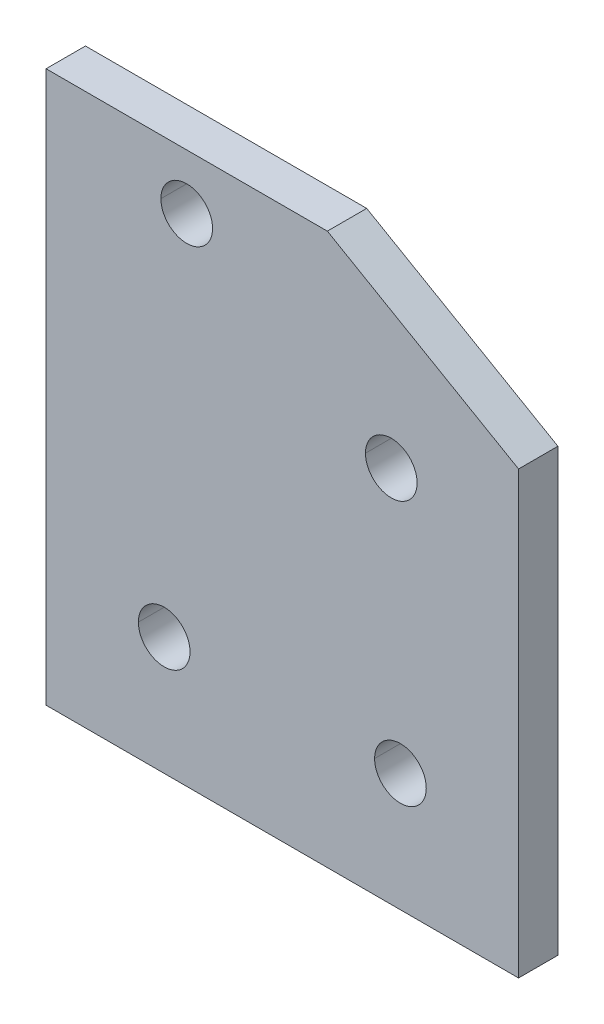
ISO-10303-21;
HEADER;
FILE_DESCRIPTION(('STEP AP214'),'2;1');
FILE_NAME('part.step','',(''),(''),'','','');
FILE_SCHEMA(('AUTOMOTIVE_DESIGN { 1 0 10303 214 1 1 1 1 }'));
ENDSEC;
DATA;
#1=APPLICATION_CONTEXT('core data for automotive mechanical design processes');
#2=APPLICATION_PROTOCOL_DEFINITION('international standard','automotive_design',2000,#1);
#3=PRODUCT_CONTEXT('',#1,'mechanical');
#4=PRODUCT('Part','Part','',(#3));
#5=PRODUCT_RELATED_PRODUCT_CATEGORY('part','',(#4));
#6=PRODUCT_DEFINITION_FORMATION('','',#4);
#7=PRODUCT_DEFINITION_CONTEXT('part definition',#1,'design');
#8=PRODUCT_DEFINITION('design','',#6,#7);
#9=PRODUCT_DEFINITION_SHAPE('','',#8);
#10=(LENGTH_UNIT() NAMED_UNIT(*) SI_UNIT(.MILLI.,.METRE.));
#11=(NAMED_UNIT(*) PLANE_ANGLE_UNIT() SI_UNIT($,.RADIAN.));
#12=(NAMED_UNIT(*) SI_UNIT($,.STERADIAN.) SOLID_ANGLE_UNIT());
#13=UNCERTAINTY_MEASURE_WITH_UNIT(LENGTH_MEASURE(1.E-05),#10,'distance_accuracy_value','');
#14=(GEOMETRIC_REPRESENTATION_CONTEXT(3) GLOBAL_UNCERTAINTY_ASSIGNED_CONTEXT((#13)) GLOBAL_UNIT_ASSIGNED_CONTEXT((#10,
#11,#12)) REPRESENTATION_CONTEXT('',''));
#15=CARTESIAN_POINT('',(0.,0.,0.));
#16=DIRECTION('',(0.,0.,1.));
#17=DIRECTION('',(1.,0.,0.));
#18=AXIS2_PLACEMENT_3D('',#15,#16,#17);
#19=CARTESIAN_POINT('',(-38.1,44.45,-3.175));
#20=DIRECTION('',(0.,-1.,0.));
#21=DIRECTION('',(0.,0.,1.));
#22=AXIS2_PLACEMENT_3D('',#19,#20,#21);
#23=PLANE('',#22);
#24=DIRECTION('',(1.,0.,0.));
#25=VECTOR('',#24,1.);
#26=CARTESIAN_POINT('',(-38.1,44.45,3.175));
#27=LINE('',#26,#25);
#28=CARTESIAN_POINT('',(-38.1,44.45,3.175));
#29=VERTEX_POINT('',#28);
#30=CARTESIAN_POINT('',(7.2644,44.45,3.175));
#31=VERTEX_POINT('',#30);
#32=EDGE_CURVE('E10',#29,#31,#27,.T.);
#33=ORIENTED_EDGE('',*,*,#32,.T.);
#34=DIRECTION('',(0.,0.,1.));
#35=VECTOR('',#34,1.);
#36=CARTESIAN_POINT('',(7.2644,44.45,-3.175));
#37=LINE('',#36,#35);
#38=CARTESIAN_POINT('',(7.2644,44.45,-3.175));
#39=VERTEX_POINT('',#38);
#40=EDGE_CURVE('E23',#39,#31,#37,.T.);
#41=ORIENTED_EDGE('',*,*,#40,.F.);
#42=DIRECTION('',(1.,0.,0.));
#43=VECTOR('',#42,1.);
#44=CARTESIAN_POINT('',(-38.1,44.45,-3.175));
#45=LINE('',#44,#43);
#46=CARTESIAN_POINT('',(-38.1,44.45,-3.175));
#47=VERTEX_POINT('',#46);
#48=EDGE_CURVE('E307',#47,#39,#45,.T.);
#49=ORIENTED_EDGE('',*,*,#48,.F.);
#50=DIRECTION('',(0.,0.,1.));
#51=VECTOR('',#50,1.);
#52=CARTESIAN_POINT('',(-38.1,44.45,-3.175));
#53=LINE('',#52,#51);
#54=EDGE_CURVE('E303',#47,#29,#53,.T.);
#55=ORIENTED_EDGE('',*,*,#54,.T.);
#56=EDGE_LOOP('',(#33,#41,#49,#55));
#57=FACE_BOUND('',#56,.T.);
#58=ADVANCED_FACE('F15',(#57),#23,.F.);
#59=CARTESIAN_POINT('',(-38.1,-44.45,-3.175));
#60=DIRECTION('',(1.,0.,0.));
#61=DIRECTION('',(0.,0.,-1.));
#62=AXIS2_PLACEMENT_3D('',#59,#60,#61);
#63=PLANE('',#62);
#64=DIRECTION('',(0.,1.,0.));
#65=VECTOR('',#64,1.);
#66=CARTESIAN_POINT('',(-38.1,-44.45,3.175));
#67=LINE('',#66,#65);
#68=CARTESIAN_POINT('',(-38.1,-44.45,3.175));
#69=VERTEX_POINT('',#68);
#70=EDGE_CURVE('E298',#69,#29,#67,.T.);
#71=ORIENTED_EDGE('',*,*,#70,.T.);
#72=ORIENTED_EDGE('',*,*,#54,.F.);
#73=DIRECTION('',(0.,1.,0.));
#74=VECTOR('',#73,1.);
#75=CARTESIAN_POINT('',(-38.1,-44.45,-3.175));
#76=LINE('',#75,#74);
#77=CARTESIAN_POINT('',(-38.1,-44.45,-3.175));
#78=VERTEX_POINT('',#77);
#79=EDGE_CURVE('E293',#78,#47,#76,.T.);
#80=ORIENTED_EDGE('',*,*,#79,.F.);
#81=DIRECTION('',(0.,0.,1.));
#82=VECTOR('',#81,1.);
#83=CARTESIAN_POINT('',(-38.1,-44.45,-3.175));
#84=LINE('',#83,#82);
#85=EDGE_CURVE('E289',#78,#69,#84,.T.);
#86=ORIENTED_EDGE('',*,*,#85,.T.);
#87=EDGE_LOOP('',(#71,#72,#80,#86));
#88=FACE_BOUND('',#87,.T.);
#89=ADVANCED_FACE('F331',(#88),#63,.F.);
#90=CARTESIAN_POINT('',(38.1,-44.45,-3.175));
#91=DIRECTION('',(0.,1.,0.));
#92=DIRECTION('',(0.,0.,-1.));
#93=AXIS2_PLACEMENT_3D('',#90,#91,#92);
#94=PLANE('',#93);
#95=DIRECTION('',(-1.,0.,0.));
#96=VECTOR('',#95,1.);
#97=CARTESIAN_POINT('',(38.1,-44.45,3.175));
#98=LINE('',#97,#96);
#99=CARTESIAN_POINT('',(38.1,-44.45,3.175));
#100=VERTEX_POINT('',#99);
#101=EDGE_CURVE('E284',#100,#69,#98,.T.);
#102=ORIENTED_EDGE('',*,*,#101,.T.);
#103=ORIENTED_EDGE('',*,*,#85,.F.);
#104=DIRECTION('',(-1.,0.,0.));
#105=VECTOR('',#104,1.);
#106=CARTESIAN_POINT('',(38.1,-44.45,-3.175));
#107=LINE('',#106,#105);
#108=CARTESIAN_POINT('',(38.1,-44.45,-3.175));
#109=VERTEX_POINT('',#108);
#110=EDGE_CURVE('E279',#109,#78,#107,.T.);
#111=ORIENTED_EDGE('',*,*,#110,.F.);
#112=DIRECTION('',(0.,0.,1.));
#113=VECTOR('',#112,1.);
#114=CARTESIAN_POINT('',(38.1,-44.45,-3.175));
#115=LINE('',#114,#113);
#116=EDGE_CURVE('E275',#109,#100,#115,.T.);
#117=ORIENTED_EDGE('',*,*,#116,.T.);
#118=EDGE_LOOP('',(#102,#103,#111,#117));
#119=FACE_BOUND('',#118,.T.);
#120=ADVANCED_FACE('F334',(#119),#94,.F.);
#121=CARTESIAN_POINT('',(38.1,26.64714,-3.175));
#122=DIRECTION('',(-1.,0.,0.));
#123=DIRECTION('',(0.,0.,1.));
#124=AXIS2_PLACEMENT_3D('',#121,#122,#123);
#125=PLANE('',#124);
#126=DIRECTION('',(0.,-1.,0.));
#127=VECTOR('',#126,1.);
#128=CARTESIAN_POINT('',(38.1,26.64714,3.175));
#129=LINE('',#128,#127);
#130=CARTESIAN_POINT('',(38.1,26.64714,3.175));
#131=VERTEX_POINT('',#130);
#132=EDGE_CURVE('E270',#131,#100,#129,.T.);
#133=ORIENTED_EDGE('',*,*,#132,.T.);
#134=ORIENTED_EDGE('',*,*,#116,.F.);
#135=DIRECTION('',(0.,-1.,0.));
#136=VECTOR('',#135,1.);
#137=CARTESIAN_POINT('',(38.1,26.64714,-3.175));
#138=LINE('',#137,#136);
#139=CARTESIAN_POINT('',(38.1,26.64714,-3.175));
#140=VERTEX_POINT('',#139);
#141=EDGE_CURVE('E265',#140,#109,#138,.T.);
#142=ORIENTED_EDGE('',*,*,#141,.F.);
#143=DIRECTION('',(0.,0.,1.));
#144=VECTOR('',#143,1.);
#145=CARTESIAN_POINT('',(38.1,26.64714,-3.175));
#146=LINE('',#145,#144);
#147=EDGE_CURVE('E261',#140,#131,#146,.T.);
#148=ORIENTED_EDGE('',*,*,#147,.T.);
#149=EDGE_LOOP('',(#133,#134,#142,#148));
#150=FACE_BOUND('',#149,.T.);
#151=ADVANCED_FACE('F326',(#150),#125,.F.);
#152=CARTESIAN_POINT('',(7.2644,44.45,-3.175));
#153=DIRECTION('',(-0.499998273583827,-0.866026400528987,0.));
#154=DIRECTION('',(-0.866026400528987,0.499998273583827,0.));
#155=AXIS2_PLACEMENT_3D('',#152,#153,#154);
#156=PLANE('',#155);
#157=DIRECTION('',(0.866026400528987,-0.499998273583827,0.));
#158=VECTOR('',#157,1.);
#159=CARTESIAN_POINT('',(7.2644,44.45,3.175));
#160=LINE('',#159,#158);
#161=EDGE_CURVE('E256',#31,#131,#160,.T.);
#162=ORIENTED_EDGE('',*,*,#161,.T.);
#163=ORIENTED_EDGE('',*,*,#147,.F.);
#164=DIRECTION('',(0.866026400528987,-0.499998273583827,0.));
#165=VECTOR('',#164,1.);
#166=CARTESIAN_POINT('',(7.2644,44.45,-3.175));
#167=LINE('',#166,#165);
#168=EDGE_CURVE('E251',#39,#140,#167,.T.);
#169=ORIENTED_EDGE('',*,*,#168,.F.);
#170=ORIENTED_EDGE('',*,*,#40,.T.);
#171=EDGE_LOOP('',(#162,#163,#169,#170));
#172=FACE_BOUND('',#171,.T.);
#173=ADVANCED_FACE('F318',(#172),#156,.F.);
#174=CARTESIAN_POINT('',(0.,-44.45,-3.175));
#175=DIRECTION('',(0.,0.,-1.));
#176=DIRECTION('',(-1.,0.,0.));
#177=AXIS2_PLACEMENT_3D('',#174,#175,#176);
#178=PLANE('',#177);
#179=CARTESIAN_POINT('',(19.05,-25.4,-3.175));
#180=DIRECTION('',(0.,0.,-1.));
#181=DIRECTION('',(-1.,0.,0.));
#182=AXIS2_PLACEMENT_3D('',#179,#180,#181);
#183=CIRCLE('',#182,4.1656);
#184=CARTESIAN_POINT('',(14.8844,-25.4,-3.175));
#185=VERTEX_POINT('',#184);
#186=CARTESIAN_POINT('',(23.2156,-25.4,-3.175));
#187=VERTEX_POINT('',#186);
#188=EDGE_CURVE('E246',#185,#187,#183,.T.);
#189=ORIENTED_EDGE('',*,*,#188,.F.);
#190=CARTESIAN_POINT('',(19.05,-25.4,-3.175));
#191=DIRECTION('',(0.,0.,-1.));
#192=DIRECTION('',(-1.,0.,0.));
#193=AXIS2_PLACEMENT_3D('',#190,#191,#192);
#194=CIRCLE('',#193,4.1656);
#195=EDGE_CURVE('E241',#187,#185,#194,.T.);
#196=ORIENTED_EDGE('',*,*,#195,.F.);
#197=EDGE_LOOP('',(#189,#196));
#198=FACE_BOUND('',#197,.T.);
#199=CARTESIAN_POINT('',(17.5768,16.51,-3.175));
#200=DIRECTION('',(0.,0.,-1.));
#201=DIRECTION('',(-1.,0.,0.));
#202=AXIS2_PLACEMENT_3D('',#199,#200,#201);
#203=CIRCLE('',#202,4.1656);
#204=CARTESIAN_POINT('',(13.4112,16.51,-3.175));
#205=VERTEX_POINT('',#204);
#206=CARTESIAN_POINT('',(21.7424,16.51,-3.175));
#207=VERTEX_POINT('',#206);
#208=EDGE_CURVE('E236',#205,#207,#203,.T.);
#209=ORIENTED_EDGE('',*,*,#208,.F.);
#210=CARTESIAN_POINT('',(17.5768,16.51,-3.175));
#211=DIRECTION('',(0.,0.,-1.));
#212=DIRECTION('',(-1.,0.,0.));
#213=AXIS2_PLACEMENT_3D('',#210,#211,#212);
#214=CIRCLE('',#213,4.1656);
#215=EDGE_CURVE('E231',#207,#205,#214,.T.);
#216=ORIENTED_EDGE('',*,*,#215,.F.);
#217=EDGE_LOOP('',(#209,#216));
#218=FACE_BOUND('',#217,.T.);
#219=CARTESIAN_POINT('',(-15.4178,35.5594411918039,-3.175));
#220=DIRECTION('',(0.,0.,-1.));
#221=DIRECTION('',(-1.,0.,0.));
#222=AXIS2_PLACEMENT_3D('',#219,#220,#221);
#223=CIRCLE('',#222,4.1656);
#224=CARTESIAN_POINT('',(-19.5834,35.5594411918039,-3.175));
#225=VERTEX_POINT('',#224);
#226=CARTESIAN_POINT('',(-11.2522,35.5594411918039,-3.175));
#227=VERTEX_POINT('',#226);
#228=EDGE_CURVE('E227',#225,#227,#223,.T.);
#229=ORIENTED_EDGE('',*,*,#228,.F.);
#230=CARTESIAN_POINT('',(-15.4178,35.5594411918039,-3.175));
#231=DIRECTION('',(0.,0.,-1.));
#232=DIRECTION('',(-1.,0.,0.));
#233=AXIS2_PLACEMENT_3D('',#230,#231,#232);
#234=CIRCLE('',#233,4.1656);
#235=EDGE_CURVE('E120',#227,#225,#234,.T.);
#236=ORIENTED_EDGE('',*,*,#235,.F.);
#237=EDGE_LOOP('',(#229,#236));
#238=FACE_BOUND('',#237,.T.);
#239=CARTESIAN_POINT('',(-19.05,-25.4,-3.175));
#240=DIRECTION('',(0.,0.,-1.));
#241=DIRECTION('',(-1.,0.,0.));
#242=AXIS2_PLACEMENT_3D('',#239,#240,#241);
#243=CIRCLE('',#242,4.1656);
#244=CARTESIAN_POINT('',(-23.2156,-25.4,-3.175));
#245=VERTEX_POINT('',#244);
#246=CARTESIAN_POINT('',(-14.8844,-25.4,-3.175));
#247=VERTEX_POINT('',#246);
#248=EDGE_CURVE('E220',#245,#247,#243,.T.);
#249=ORIENTED_EDGE('',*,*,#248,.F.);
#250=CARTESIAN_POINT('',(-19.05,-25.4,-3.175));
#251=DIRECTION('',(0.,0.,-1.));
#252=DIRECTION('',(-1.,0.,0.));
#253=AXIS2_PLACEMENT_3D('',#250,#251,#252);
#254=CIRCLE('',#253,4.1656);
#255=EDGE_CURVE('E216',#247,#245,#254,.T.);
#256=ORIENTED_EDGE('',*,*,#255,.F.);
#257=EDGE_LOOP('',(#249,#256));
#258=FACE_BOUND('',#257,.T.);
#259=ORIENTED_EDGE('',*,*,#168,.T.);
#260=ORIENTED_EDGE('',*,*,#141,.T.);
#261=ORIENTED_EDGE('',*,*,#110,.T.);
#262=ORIENTED_EDGE('',*,*,#79,.T.);
#263=ORIENTED_EDGE('',*,*,#48,.T.);
#264=EDGE_LOOP('',(#259,#260,#261,#262,#263));
#265=FACE_BOUND('',#264,.T.);
#266=ADVANCED_FACE('F328',(#198,#218,#238,#258,#265),#178,.T.);
#267=CARTESIAN_POINT('',(-19.05,-25.4,-3.175));
#268=DIRECTION('',(0.,0.,-1.));
#269=DIRECTION('',(0.,1.,0.));
#270=AXIS2_PLACEMENT_3D('',#267,#268,#269);
#271=CYLINDRICAL_SURFACE('',#270,4.1656);
#272=CARTESIAN_POINT('',(-19.05,-25.4,3.175));
#273=DIRECTION('',(0.,0.,-1.));
#274=DIRECTION('',(-1.,0.,0.));
#275=AXIS2_PLACEMENT_3D('',#272,#273,#274);
#276=CIRCLE('',#275,4.1656);
#277=CARTESIAN_POINT('',(-14.8844,-25.4,3.175));
#278=VERTEX_POINT('',#277);
#279=CARTESIAN_POINT('',(-23.2156,-25.4,3.175));
#280=VERTEX_POINT('',#279);
#281=EDGE_CURVE('E213',#278,#280,#276,.T.);
#282=ORIENTED_EDGE('',*,*,#281,.F.);
#283=CARTESIAN_POINT('',(-14.8844,-25.4,3.175));
#284=DIRECTION('',(0.,0.,-1.));
#285=VECTOR('',#284,1.);
#286=LINE('',#283,#285);
#287=EDGE_CURVE('E190',#278,#247,#286,.T.);
#288=ORIENTED_EDGE('',*,*,#287,.T.);
#289=ORIENTED_EDGE('',*,*,#255,.T.);
#290=CARTESIAN_POINT('',(-23.2156,-25.4,3.175));
#291=DIRECTION('',(0.,0.,-1.));
#292=VECTOR('',#291,1.);
#293=LINE('',#290,#292);
#294=EDGE_CURVE('E203',#280,#245,#293,.T.);
#295=ORIENTED_EDGE('',*,*,#294,.F.);
#296=EDGE_LOOP('',(#282,#288,#289,#295));
#297=FACE_BOUND('',#296,.T.);
#298=ADVANCED_FACE('F168',(#297),#271,.F.);
#299=CARTESIAN_POINT('',(-19.05,-25.4,-3.175));
#300=DIRECTION('',(0.,0.,-1.));
#301=DIRECTION('',(0.,-1.,0.));
#302=AXIS2_PLACEMENT_3D('',#299,#300,#301);
#303=CYLINDRICAL_SURFACE('',#302,4.1656);
#304=ORIENTED_EDGE('',*,*,#248,.T.);
#305=ORIENTED_EDGE('',*,*,#287,.F.);
#306=CARTESIAN_POINT('',(-19.05,-25.4,3.175));
#307=DIRECTION('',(0.,0.,-1.));
#308=DIRECTION('',(-1.,0.,0.));
#309=AXIS2_PLACEMENT_3D('',#306,#307,#308);
#310=CIRCLE('',#309,4.1656);
#311=EDGE_CURVE('E149',#280,#278,#310,.T.);
#312=ORIENTED_EDGE('',*,*,#311,.F.);
#313=ORIENTED_EDGE('',*,*,#294,.T.);
#314=EDGE_LOOP('',(#304,#305,#312,#313));
#315=FACE_BOUND('',#314,.T.);
#316=ADVANCED_FACE('F158',(#315),#303,.F.);
#317=CARTESIAN_POINT('',(0.,-44.45,3.175));
#318=DIRECTION('',(0.,0.,-1.));
#319=DIRECTION('',(-1.,0.,0.));
#320=AXIS2_PLACEMENT_3D('',#317,#318,#319);
#321=PLANE('',#320);
#322=CARTESIAN_POINT('',(19.05,-25.4,3.175));
#323=DIRECTION('',(0.,0.,-1.));
#324=DIRECTION('',(-1.,0.,0.));
#325=AXIS2_PLACEMENT_3D('',#322,#323,#324);
#326=CIRCLE('',#325,4.1656);
#327=CARTESIAN_POINT('',(14.8844,-25.4,3.175));
#328=VERTEX_POINT('',#327);
#329=CARTESIAN_POINT('',(23.2156,-25.4,3.175));
#330=VERTEX_POINT('',#329);
#331=EDGE_CURVE('E145',#328,#330,#326,.T.);
#332=ORIENTED_EDGE('',*,*,#331,.T.);
#333=CARTESIAN_POINT('',(19.05,-25.4,3.175));
#334=DIRECTION('',(0.,0.,-1.));
#335=DIRECTION('',(-1.,0.,0.));
#336=AXIS2_PLACEMENT_3D('',#333,#334,#335);
#337=CIRCLE('',#336,4.1656);
#338=EDGE_CURVE('E141',#330,#328,#337,.T.);
#339=ORIENTED_EDGE('',*,*,#338,.T.);
#340=EDGE_LOOP('',(#332,#339));
#341=FACE_BOUND('',#340,.T.);
#342=CARTESIAN_POINT('',(17.5768,16.51,3.175));
#343=DIRECTION('',(0.,0.,-1.));
#344=DIRECTION('',(-1.,0.,0.));
#345=AXIS2_PLACEMENT_3D('',#342,#343,#344);
#346=CIRCLE('',#345,4.1656);
#347=CARTESIAN_POINT('',(13.4112,16.51,3.175));
#348=VERTEX_POINT('',#347);
#349=CARTESIAN_POINT('',(21.7424,16.51,3.175));
#350=VERTEX_POINT('',#349);
#351=EDGE_CURVE('E131',#348,#350,#346,.T.);
#352=ORIENTED_EDGE('',*,*,#351,.T.);
#353=CARTESIAN_POINT('',(17.5768,16.51,3.175));
#354=DIRECTION('',(0.,0.,-1.));
#355=DIRECTION('',(-1.,0.,0.));
#356=AXIS2_PLACEMENT_3D('',#353,#354,#355);
#357=CIRCLE('',#356,4.1656);
#358=EDGE_CURVE('E129',#350,#348,#357,.T.);
#359=ORIENTED_EDGE('',*,*,#358,.T.);
#360=EDGE_LOOP('',(#352,#359));
#361=FACE_BOUND('',#360,.T.);
#362=CARTESIAN_POINT('',(-15.4178,35.5594411918039,3.175));
#363=DIRECTION('',(0.,0.,-1.));
#364=DIRECTION('',(-1.,0.,0.));
#365=AXIS2_PLACEMENT_3D('',#362,#363,#364);
#366=CIRCLE('',#365,4.1656);
#367=CARTESIAN_POINT('',(-19.5834,35.5594411918039,3.175));
#368=VERTEX_POINT('',#367);
#369=CARTESIAN_POINT('',(-11.2522,35.5594411918039,3.175));
#370=VERTEX_POINT('',#369);
#371=EDGE_CURVE('E109',#368,#370,#366,.T.);
#372=ORIENTED_EDGE('',*,*,#371,.T.);
#373=CARTESIAN_POINT('',(-15.4178,35.5594411918039,3.175));
#374=DIRECTION('',(0.,0.,-1.));
#375=DIRECTION('',(-1.,0.,0.));
#376=AXIS2_PLACEMENT_3D('',#373,#374,#375);
#377=CIRCLE('',#376,4.1656);
#378=EDGE_CURVE('E104',#370,#368,#377,.T.);
#379=ORIENTED_EDGE('',*,*,#378,.T.);
#380=EDGE_LOOP('',(#372,#379));
#381=FACE_BOUND('',#380,.T.);
#382=ORIENTED_EDGE('',*,*,#311,.T.);
#383=ORIENTED_EDGE('',*,*,#281,.T.);
#384=EDGE_LOOP('',(#382,#383));
#385=FACE_BOUND('',#384,.T.);
#386=ORIENTED_EDGE('',*,*,#161,.F.);
#387=ORIENTED_EDGE('',*,*,#32,.F.);
#388=ORIENTED_EDGE('',*,*,#70,.F.);
#389=ORIENTED_EDGE('',*,*,#101,.F.);
#390=ORIENTED_EDGE('',*,*,#132,.F.);
#391=EDGE_LOOP('',(#386,#387,#388,#389,#390));
#392=FACE_BOUND('',#391,.T.);
#393=ADVANCED_FACE('F106',(#341,#361,#381,#385,#392),#321,.F.);
#394=CARTESIAN_POINT('',(-15.4178,35.5594411918039,-3.175));
#395=DIRECTION('',(0.,0.,-1.));
#396=DIRECTION('',(0.,1.,0.));
#397=AXIS2_PLACEMENT_3D('',#394,#395,#396);
#398=CYLINDRICAL_SURFACE('',#397,4.1656);
#399=ORIENTED_EDGE('',*,*,#378,.F.);
#400=CARTESIAN_POINT('',(-11.2522,35.5594411918039,3.175));
#401=DIRECTION('',(0.,0.,-1.));
#402=VECTOR('',#401,1.);
#403=LINE('',#400,#402);
#404=EDGE_CURVE('E113',#370,#227,#403,.T.);
#405=ORIENTED_EDGE('',*,*,#404,.T.);
#406=ORIENTED_EDGE('',*,*,#235,.T.);
#407=CARTESIAN_POINT('',(-19.5834,35.5594411918039,3.175));
#408=DIRECTION('',(0.,0.,-1.));
#409=VECTOR('',#408,1.);
#410=LINE('',#407,#409);
#411=EDGE_CURVE('E117',#368,#225,#410,.T.);
#412=ORIENTED_EDGE('',*,*,#411,.F.);
#413=EDGE_LOOP('',(#399,#405,#406,#412));
#414=FACE_BOUND('',#413,.T.);
#415=ADVANCED_FACE('F119',(#414),#398,.F.);
#416=CARTESIAN_POINT('',(-15.4178,35.5594411918039,-3.175));
#417=DIRECTION('',(0.,0.,-1.));
#418=DIRECTION('',(0.,-1.,0.));
#419=AXIS2_PLACEMENT_3D('',#416,#417,#418);
#420=CYLINDRICAL_SURFACE('',#419,4.1656);
#421=ORIENTED_EDGE('',*,*,#228,.T.);
#422=ORIENTED_EDGE('',*,*,#404,.F.);
#423=ORIENTED_EDGE('',*,*,#371,.F.);
#424=ORIENTED_EDGE('',*,*,#411,.T.);
#425=EDGE_LOOP('',(#421,#422,#423,#424));
#426=FACE_BOUND('',#425,.T.);
#427=ADVANCED_FACE('F127',(#426),#420,.F.);
#428=CARTESIAN_POINT('',(17.5768,16.51,-3.175));
#429=DIRECTION('',(0.,0.,-1.));
#430=DIRECTION('',(0.,1.,0.));
#431=AXIS2_PLACEMENT_3D('',#428,#429,#430);
#432=CYLINDRICAL_SURFACE('',#431,4.1656);
#433=ORIENTED_EDGE('',*,*,#358,.F.);
#434=CARTESIAN_POINT('',(21.7424,16.51,3.175));
#435=DIRECTION('',(0.,0.,-1.));
#436=VECTOR('',#435,1.);
#437=LINE('',#434,#436);
#438=EDGE_CURVE('E124',#350,#207,#437,.T.);
#439=ORIENTED_EDGE('',*,*,#438,.T.);
#440=ORIENTED_EDGE('',*,*,#215,.T.);
#441=CARTESIAN_POINT('',(13.4112,16.51,3.175));
#442=DIRECTION('',(0.,0.,-1.));
#443=VECTOR('',#442,1.);
#444=LINE('',#441,#443);
#445=EDGE_CURVE('E513',#348,#205,#444,.T.);
#446=ORIENTED_EDGE('',*,*,#445,.F.);
#447=EDGE_LOOP('',(#433,#439,#440,#446));
#448=FACE_BOUND('',#447,.T.);
#449=ADVANCED_FACE('F445',(#448),#432,.F.);
#450=CARTESIAN_POINT('',(17.5768,16.51,-3.175));
#451=DIRECTION('',(0.,0.,-1.));
#452=DIRECTION('',(0.,-1.,0.));
#453=AXIS2_PLACEMENT_3D('',#450,#451,#452);
#454=CYLINDRICAL_SURFACE('',#453,4.1656);
#455=ORIENTED_EDGE('',*,*,#208,.T.);
#456=ORIENTED_EDGE('',*,*,#438,.F.);
#457=ORIENTED_EDGE('',*,*,#351,.F.);
#458=ORIENTED_EDGE('',*,*,#445,.T.);
#459=EDGE_LOOP('',(#455,#456,#457,#458));
#460=FACE_BOUND('',#459,.T.);
#461=ADVANCED_FACE('F456',(#460),#454,.F.);
#462=CARTESIAN_POINT('',(19.05,-25.4,-3.175));
#463=DIRECTION('',(0.,0.,-1.));
#464=DIRECTION('',(0.,1.,0.));
#465=AXIS2_PLACEMENT_3D('',#462,#463,#464);
#466=CYLINDRICAL_SURFACE('',#465,4.1656);
#467=ORIENTED_EDGE('',*,*,#338,.F.);
#468=CARTESIAN_POINT('',(23.2156,-25.4,3.175));
#469=DIRECTION('',(0.,0.,-1.));
#470=VECTOR('',#469,1.);
#471=LINE('',#468,#470);
#472=EDGE_CURVE('E511',#330,#187,#471,.T.);
#473=ORIENTED_EDGE('',*,*,#472,.T.);
#474=ORIENTED_EDGE('',*,*,#195,.T.);
#475=CARTESIAN_POINT('',(14.8844,-25.4,3.175));
#476=DIRECTION('',(0.,0.,-1.));
#477=VECTOR('',#476,1.);
#478=LINE('',#475,#477);
#479=EDGE_CURVE('E507',#328,#185,#478,.T.);
#480=ORIENTED_EDGE('',*,*,#479,.F.);
#481=EDGE_LOOP('',(#467,#473,#474,#480));
#482=FACE_BOUND('',#481,.T.);
#483=ADVANCED_FACE('F467',(#482),#466,.F.);
#484=CARTESIAN_POINT('',(19.05,-25.4,-3.175));
#485=DIRECTION('',(0.,0.,-1.));
#486=DIRECTION('',(0.,-1.,0.));
#487=AXIS2_PLACEMENT_3D('',#484,#485,#486);
#488=CYLINDRICAL_SURFACE('',#487,4.1656);
#489=ORIENTED_EDGE('',*,*,#188,.T.);
#490=ORIENTED_EDGE('',*,*,#472,.F.);
#491=ORIENTED_EDGE('',*,*,#331,.F.);
#492=ORIENTED_EDGE('',*,*,#479,.T.);
#493=EDGE_LOOP('',(#489,#490,#491,#492));
#494=FACE_BOUND('',#493,.T.);
#495=ADVANCED_FACE('F356',(#494),#488,.F.);
#496=CLOSED_SHELL('',(#58,#89,#120,#151,#173,#266,#298,#316,#393,#415,#427,#449,#461,#483,#495));
#497=MANIFOLD_SOLID_BREP('B1',#496);
#498=ADVANCED_BREP_SHAPE_REPRESENTATION('',(#18,#497),#14);
#499=SHAPE_DEFINITION_REPRESENTATION(#9,#498);
ENDSEC;
END-ISO-10303-21;
